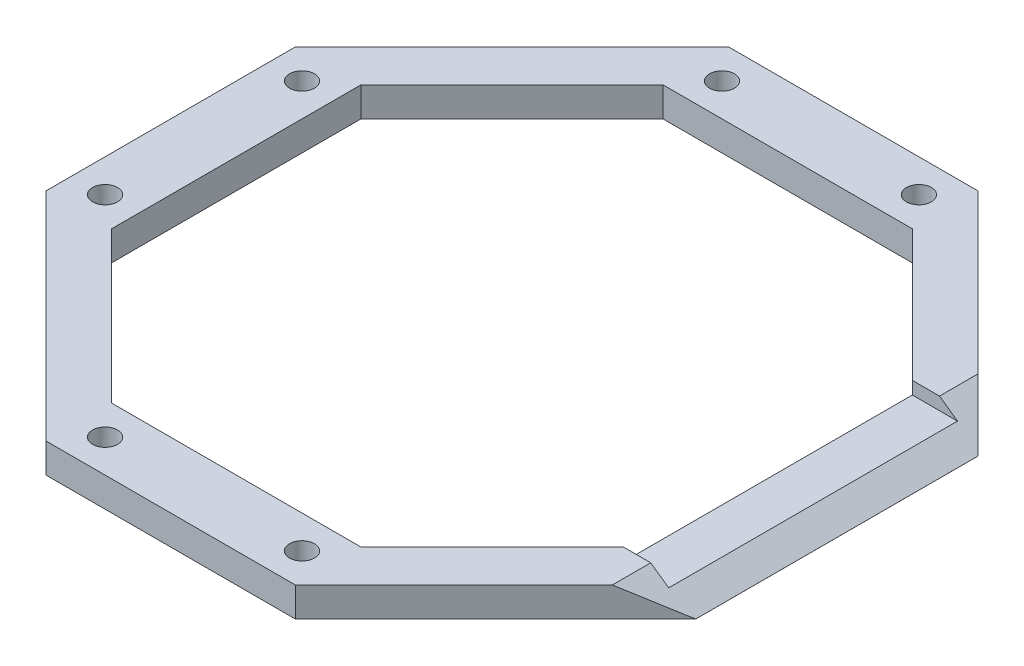
ISO-10303-21;
HEADER;
FILE_DESCRIPTION(('STEP AP214'),'2;1');
FILE_NAME('part.step','',(''),(''),'','','');
FILE_SCHEMA(('AUTOMOTIVE_DESIGN { 1 0 10303 214 1 1 1 1 }'));
ENDSEC;
DATA;
#1=APPLICATION_CONTEXT('core data for automotive mechanical design processes');
#2=APPLICATION_PROTOCOL_DEFINITION('international standard','automotive_design',2000,#1);
#3=PRODUCT_CONTEXT('',#1,'mechanical');
#4=PRODUCT('Part','Part','',(#3));
#5=PRODUCT_RELATED_PRODUCT_CATEGORY('part','',(#4));
#6=PRODUCT_DEFINITION_FORMATION('','',#4);
#7=PRODUCT_DEFINITION_CONTEXT('part definition',#1,'design');
#8=PRODUCT_DEFINITION('design','',#6,#7);
#9=PRODUCT_DEFINITION_SHAPE('','',#8);
#10=(LENGTH_UNIT() NAMED_UNIT(*) SI_UNIT(.MILLI.,.METRE.));
#11=(NAMED_UNIT(*) PLANE_ANGLE_UNIT() SI_UNIT($,.RADIAN.));
#12=(NAMED_UNIT(*) SI_UNIT($,.STERADIAN.) SOLID_ANGLE_UNIT());
#13=UNCERTAINTY_MEASURE_WITH_UNIT(LENGTH_MEASURE(1.E-05),#10,'distance_accuracy_value','');
#14=(GEOMETRIC_REPRESENTATION_CONTEXT(3) GLOBAL_UNCERTAINTY_ASSIGNED_CONTEXT((#13)) GLOBAL_UNIT_ASSIGNED_CONTEXT((#10,
#11,#12)) REPRESENTATION_CONTEXT('',''));
#15=CARTESIAN_POINT('',(0.,0.,0.));
#16=DIRECTION('',(0.,0.,1.));
#17=DIRECTION('',(1.,0.,0.));
#18=AXIS2_PLACEMENT_3D('',#15,#16,#17);
#19=CARTESIAN_POINT('',(0.,4.5,0.));
#20=DIRECTION('',(0.,1.,0.));
#21=DIRECTION('',(0.,0.,1.));
#22=AXIS2_PLACEMENT_3D('',#19,#20,#21);
#23=PLANE('',#22);
#24=CARTESIAN_POINT('',(-15.,4.5,-46.9969797719559));
#25=DIRECTION('',(0.,1.,0.));
#26=DIRECTION('',(0.,0.,1.));
#27=AXIS2_PLACEMENT_3D('',#24,#25,#26);
#28=CIRCLE('',#27,1.89999999999999);
#29=CARTESIAN_POINT('',(-15.,4.5,-45.0969797719559));
#30=VERTEX_POINT('',#29);
#31=EDGE_CURVE('E500',#30,#30,#28,.T.);
#32=ORIENTED_EDGE('',*,*,#31,.F.);
#33=EDGE_LOOP('',(#32));
#34=FACE_BOUND('',#33,.T.);
#35=CARTESIAN_POINT('',(-46.9969797719557,4.5,-15.));
#36=DIRECTION('',(0.,1.,0.));
#37=DIRECTION('',(0.,0.,1.));
#38=AXIS2_PLACEMENT_3D('',#35,#36,#37);
#39=CIRCLE('',#38,1.89999999999999);
#40=CARTESIAN_POINT('',(-46.9969797719557,4.5,-13.1));
#41=VERTEX_POINT('',#40);
#42=EDGE_CURVE('E297',#41,#41,#39,.T.);
#43=ORIENTED_EDGE('',*,*,#42,.F.);
#44=EDGE_LOOP('',(#43));
#45=FACE_BOUND('',#44,.T.);
#46=CARTESIAN_POINT('',(15.,4.5,-46.9969797719559));
#47=DIRECTION('',(0.,1.,0.));
#48=DIRECTION('',(0.,0.,1.));
#49=AXIS2_PLACEMENT_3D('',#46,#47,#48);
#50=CIRCLE('',#49,1.89999999999999);
#51=CARTESIAN_POINT('',(15.,4.5,-45.0969797719559));
#52=VERTEX_POINT('',#51);
#53=EDGE_CURVE('E287',#52,#52,#50,.T.);
#54=ORIENTED_EDGE('',*,*,#53,.F.);
#55=EDGE_LOOP('',(#54));
#56=FACE_BOUND('',#55,.T.);
#57=CARTESIAN_POINT('',(15.,4.5,46.9969797719559));
#58=DIRECTION('',(0.,1.,0.));
#59=DIRECTION('',(0.,0.,1.));
#60=AXIS2_PLACEMENT_3D('',#57,#58,#59);
#61=CIRCLE('',#60,1.89999999999999);
#62=CARTESIAN_POINT('',(15.,4.5,48.8969797719559));
#63=VERTEX_POINT('',#62);
#64=EDGE_CURVE('E284',#63,#63,#61,.T.);
#65=ORIENTED_EDGE('',*,*,#64,.F.);
#66=EDGE_LOOP('',(#65));
#67=FACE_BOUND('',#66,.T.);
#68=CARTESIAN_POINT('',(-15.,4.5,46.9969797719559));
#69=DIRECTION('',(0.,1.,0.));
#70=DIRECTION('',(0.,0.,1.));
#71=AXIS2_PLACEMENT_3D('',#68,#69,#70);
#72=CIRCLE('',#71,1.89999999999999);
#73=CARTESIAN_POINT('',(-15.,4.5,48.8969797719559));
#74=VERTEX_POINT('',#73);
#75=EDGE_CURVE('E281',#74,#74,#72,.T.);
#76=ORIENTED_EDGE('',*,*,#75,.F.);
#77=EDGE_LOOP('',(#76));
#78=FACE_BOUND('',#77,.T.);
#79=CARTESIAN_POINT('',(-46.9969797719557,4.5,15.));
#80=DIRECTION('',(0.,1.,0.));
#81=DIRECTION('',(0.,0.,1.));
#82=AXIS2_PLACEMENT_3D('',#79,#80,#81);
#83=CIRCLE('',#82,1.89999999999999);
#84=CARTESIAN_POINT('',(-46.9969797719557,4.5,16.9));
#85=VERTEX_POINT('',#84);
#86=EDGE_CURVE('E280',#85,#85,#83,.T.);
#87=ORIENTED_EDGE('',*,*,#86,.F.);
#88=EDGE_LOOP('',(#87));
#89=FACE_BOUND('',#88,.T.);
#90=DIRECTION('',(-1.,0.,0.));
#91=VECTOR('',#90,1.);
#92=CARTESIAN_POINT('',(71.4939595439114,4.5,-21.9999999999995));
#93=LINE('',#92,#91);
#94=CARTESIAN_POINT('',(43.1412186702168,4.5,-21.9999999999995));
#95=VERTEX_POINT('',#94);
#96=CARTESIAN_POINT('',(38.9939595439114,4.5,-21.9999999999995));
#97=VERTEX_POINT('',#96);
#98=EDGE_CURVE('E187',#95,#97,#93,.T.);
#99=ORIENTED_EDGE('',*,*,#98,.F.);
#100=DIRECTION('',(0.,0.,1.));
#101=VECTOR('',#100,1.);
#102=CARTESIAN_POINT('',(43.1412186702168,4.50000000000001,-44.5030202280456));
#103=LINE('',#102,#101);
#104=CARTESIAN_POINT('',(43.1412186702167,4.50000000000001,-27.8539993935419));
#105=VERTEX_POINT('',#104);
#106=EDGE_CURVE('E313',#105,#95,#103,.T.);
#107=ORIENTED_EDGE('',*,*,#106,.F.);
#108=DIRECTION('',(-0.707036743398339,0.,-0.707176812038313));
#109=VECTOR('',#108,1.);
#110=CARTESIAN_POINT('',(19.0030202280441,4.5,-51.9969797719559));
#111=LINE('',#110,#109);
#112=CARTESIAN_POINT('',(19.0030202280441,4.5,-51.9969797719559));
#113=VERTEX_POINT('',#112);
#114=EDGE_CURVE('E218',#105,#113,#111,.T.);
#115=ORIENTED_EDGE('',*,*,#114,.T.);
#116=DIRECTION('',(-1.,0.,0.));
#117=VECTOR('',#116,1.);
#118=CARTESIAN_POINT('',(19.0030202280441,4.5,-51.9969797719559));
#119=LINE('',#118,#117);
#120=CARTESIAN_POINT('',(-18.9969797719562,4.5,-51.9969797719559));
#121=VERTEX_POINT('',#120);
#122=EDGE_CURVE('E220',#113,#121,#119,.T.);
#123=ORIENTED_EDGE('',*,*,#122,.T.);
#124=DIRECTION('',(-0.707106781186547,0.,0.707106781186547));
#125=VECTOR('',#124,1.);
#126=CARTESIAN_POINT('',(-51.9969797719557,4.5,-18.9969797719563));
#127=LINE('',#126,#125);
#128=CARTESIAN_POINT('',(-51.9969797719557,4.5,-18.9969797719563));
#129=VERTEX_POINT('',#128);
#130=EDGE_CURVE('E223',#121,#129,#127,.T.);
#131=ORIENTED_EDGE('',*,*,#130,.T.);
#132=DIRECTION('',(0.,0.,1.));
#133=VECTOR('',#132,1.);
#134=CARTESIAN_POINT('',(-51.9969797719557,4.5,18.9969797719549));
#135=LINE('',#134,#133);
#136=CARTESIAN_POINT('',(-51.9969797719557,4.5,18.9969797719549));
#137=VERTEX_POINT('',#136);
#138=EDGE_CURVE('E225',#129,#137,#135,.T.);
#139=ORIENTED_EDGE('',*,*,#138,.T.);
#140=DIRECTION('',(0.707106781186551,0.,0.707106781186544));
#141=VECTOR('',#140,1.);
#142=CARTESIAN_POINT('',(-18.9969797719559,4.5,51.9969797719544));
#143=LINE('',#142,#141);
#144=CARTESIAN_POINT('',(-18.9969797719559,4.5,51.9969797719544));
#145=VERTEX_POINT('',#144);
#146=EDGE_CURVE('E227',#137,#145,#143,.T.);
#147=ORIENTED_EDGE('',*,*,#146,.T.);
#148=DIRECTION('',(1.,0.,0.));
#149=VECTOR('',#148,1.);
#150=CARTESIAN_POINT('',(19.0030202280446,4.5,51.9969797719544));
#151=LINE('',#150,#149);
#152=CARTESIAN_POINT('',(19.0030202280446,4.5,51.9969797719544));
#153=VERTEX_POINT('',#152);
#154=EDGE_CURVE('E229',#145,#153,#151,.T.);
#155=ORIENTED_EDGE('',*,*,#154,.T.);
#156=DIRECTION('',(0.70703674339835,0.,-0.707176812038302));
#157=VECTOR('',#156,1.);
#158=CARTESIAN_POINT('',(49.4939595439114,4.5,21.5));
#159=LINE('',#158,#157);
#160=CARTESIAN_POINT('',(43.1412186702168,4.50000000000001,27.8539993935417));
#161=VERTEX_POINT('',#160);
#162=EDGE_CURVE('E231',#153,#161,#159,.T.);
#163=ORIENTED_EDGE('',*,*,#162,.T.);
#164=CARTESIAN_POINT('',(43.1412186702167,4.50000000000001,22.0000000000005));
#165=VERTEX_POINT('',#164);
#166=EDGE_CURVE('E308',#165,#161,#103,.T.);
#167=ORIENTED_EDGE('',*,*,#166,.F.);
#168=DIRECTION('',(-1.,0.,0.));
#169=VECTOR('',#168,1.);
#170=CARTESIAN_POINT('',(71.4939595439114,4.5,22.0000000000005));
#171=LINE('',#170,#169);
#172=CARTESIAN_POINT('',(38.9939595439114,4.5,22.0000000000005));
#173=VERTEX_POINT('',#172);
#174=EDGE_CURVE('E309',#165,#173,#171,.T.);
#175=ORIENTED_EDGE('',*,*,#174,.T.);
#176=DIRECTION('',(0.707106781186569,0.,-0.707106781186526));
#177=VECTOR('',#176,1.);
#178=CARTESIAN_POINT('',(18.9969797719549,4.5,41.9969797719557));
#179=LINE('',#178,#177);
#180=CARTESIAN_POINT('',(18.9969797719549,4.5,41.9969797719557));
#181=VERTEX_POINT('',#180);
#182=EDGE_CURVE('E325',#181,#173,#179,.T.);
#183=ORIENTED_EDGE('',*,*,#182,.F.);
#184=DIRECTION('',(1.,0.,0.));
#185=VECTOR('',#184,1.);
#186=CARTESIAN_POINT('',(18.9969797719549,4.5,41.9969797719557));
#187=LINE('',#186,#185);
#188=CARTESIAN_POINT('',(-18.9969797719563,4.5,41.9969797719557));
#189=VERTEX_POINT('',#188);
#190=EDGE_CURVE('E322',#189,#181,#187,.T.);
#191=ORIENTED_EDGE('',*,*,#190,.F.);
#192=DIRECTION('',(0.707106781186526,0.,0.707106781186569));
#193=VECTOR('',#192,1.);
#194=CARTESIAN_POINT('',(-18.9969797719563,4.5,41.9969797719557));
#195=LINE('',#194,#193);
#196=CARTESIAN_POINT('',(-41.9969797719557,4.5,18.9969797719549));
#197=VERTEX_POINT('',#196);
#198=EDGE_CURVE('E320',#197,#189,#195,.T.);
#199=ORIENTED_EDGE('',*,*,#198,.F.);
#200=DIRECTION('',(0.,0.,1.));
#201=VECTOR('',#200,1.);
#202=CARTESIAN_POINT('',(-41.9969797719557,4.5,18.9969797719549));
#203=LINE('',#202,#201);
#204=CARTESIAN_POINT('',(-41.9969797719557,4.5,-18.9969797719563));
#205=VERTEX_POINT('',#204);
#206=EDGE_CURVE('E335',#205,#197,#203,.T.);
#207=ORIENTED_EDGE('',*,*,#206,.F.);
#208=DIRECTION('',(-0.707106781186569,0.,0.707106781186526));
#209=VECTOR('',#208,1.);
#210=CARTESIAN_POINT('',(-41.9969797719557,4.5,-18.9969797719563));
#211=LINE('',#210,#209);
#212=CARTESIAN_POINT('',(-18.9969797719549,4.5,-41.9969797719557));
#213=VERTEX_POINT('',#212);
#214=EDGE_CURVE('E332',#213,#205,#211,.T.);
#215=ORIENTED_EDGE('',*,*,#214,.F.);
#216=DIRECTION('',(-1.,0.,0.));
#217=VECTOR('',#216,1.);
#218=CARTESIAN_POINT('',(-18.9969797719549,4.5,-41.9969797719557));
#219=LINE('',#218,#217);
#220=CARTESIAN_POINT('',(18.9969797719563,4.5,-41.9969797719557));
#221=VERTEX_POINT('',#220);
#222=EDGE_CURVE('E330',#221,#213,#219,.T.);
#223=ORIENTED_EDGE('',*,*,#222,.F.);
#224=DIRECTION('',(-0.707106781186526,0.,-0.707106781186569));
#225=VECTOR('',#224,1.);
#226=CARTESIAN_POINT('',(18.9969797719563,4.5,-41.9969797719557));
#227=LINE('',#226,#225);
#228=EDGE_CURVE('E328',#97,#221,#227,.T.);
#229=ORIENTED_EDGE('',*,*,#228,.F.);
#230=EDGE_LOOP('',(#99,#107,#115,#123,#131,#139,#147,#155,#163,#167,#175,#183,#191,#199,#207,
#215,#223,#229));
#231=FACE_BOUND('',#230,.T.);
#232=ADVANCED_FACE('F36',(#34,#45,#56,#67,#78,#89,#231),#23,.T.);
#233=CARTESIAN_POINT('',(19.0030202280441,4.5,-51.9969797719559));
#234=DIRECTION('',(-0.707176812038313,0.,0.707036743398339));
#235=DIRECTION('',(0.707036743398339,0.,0.707176812038313));
#236=AXIS2_PLACEMENT_3D('',#233,#234,#235);
#237=PLANE('',#236);
#238=DIRECTION('',(-0.632302386877257,0.447469506086105,-0.632427650148522));
#239=VECTOR('',#238,1.);
#240=CARTESIAN_POINT('',(23.8361865712853,18.161838635384,-47.1628559465996));
#241=LINE('',#240,#239);
#242=CARTESIAN_POINT('',(49.4939595439114,0.0042747267108463,-21.5));
#243=VERTEX_POINT('',#242);
#244=EDGE_CURVE('E317',#243,#105,#241,.T.);
#245=ORIENTED_EDGE('',*,*,#244,.F.);
#246=DIRECTION('',(0.,-1.,0.));
#247=VECTOR('',#246,1.);
#248=CARTESIAN_POINT('',(49.4939595439114,4.5,-21.5));
#249=LINE('',#248,#247);
#250=CARTESIAN_POINT('',(49.4939595439114,0.,-21.5));
#251=VERTEX_POINT('',#250);
#252=EDGE_CURVE('E234',#243,#251,#249,.T.);
#253=ORIENTED_EDGE('',*,*,#252,.T.);
#254=DIRECTION('',(-0.707036743398339,0.,-0.707176812038313));
#255=VECTOR('',#254,1.);
#256=CARTESIAN_POINT('',(19.0030202280441,0.,-51.9969797719559));
#257=LINE('',#256,#255);
#258=CARTESIAN_POINT('',(19.0030202280441,0.,-51.9969797719559));
#259=VERTEX_POINT('',#258);
#260=EDGE_CURVE('E217',#251,#259,#257,.T.);
#261=ORIENTED_EDGE('',*,*,#260,.T.);
#262=DIRECTION('',(0.,-1.,0.));
#263=VECTOR('',#262,1.);
#264=CARTESIAN_POINT('',(19.0030202280441,4.5,-51.9969797719559));
#265=LINE('',#264,#263);
#266=EDGE_CURVE('E270',#113,#259,#265,.T.);
#267=ORIENTED_EDGE('',*,*,#266,.F.);
#268=ORIENTED_EDGE('',*,*,#114,.F.);
#269=EDGE_LOOP('',(#245,#253,#261,#267,#268));
#270=FACE_BOUND('',#269,.T.);
#271=ADVANCED_FACE('F38',(#270),#237,.F.);
#272=CARTESIAN_POINT('',(49.4939595439114,4.5,21.5));
#273=DIRECTION('',(-0.707176812038302,0.,-0.70703674339835));
#274=DIRECTION('',(-0.70703674339835,0.,0.707176812038302));
#275=AXIS2_PLACEMENT_3D('',#272,#273,#274);
#276=PLANE('',#275);
#277=DIRECTION('',(0.632302386877265,-0.44746950608611,-0.63242765014851));
#278=VECTOR('',#277,1.);
#279=CARTESIAN_POINT('',(48.2219568527565,0.904449117578314,22.7722546832736));
#280=LINE('',#279,#278);
#281=CARTESIAN_POINT('',(49.4939595439114,0.0042747267108463,21.5));
#282=VERTEX_POINT('',#281);
#283=EDGE_CURVE('E61',#161,#282,#280,.T.);
#284=ORIENTED_EDGE('',*,*,#283,.F.);
#285=ORIENTED_EDGE('',*,*,#162,.F.);
#286=DIRECTION('',(0.,-1.,0.));
#287=VECTOR('',#286,1.);
#288=CARTESIAN_POINT('',(19.0030202280446,4.5,51.9969797719544));
#289=LINE('',#288,#287);
#290=CARTESIAN_POINT('',(19.0030202280446,0.,51.9969797719544));
#291=VERTEX_POINT('',#290);
#292=EDGE_CURVE('E255',#153,#291,#289,.T.);
#293=ORIENTED_EDGE('',*,*,#292,.T.);
#294=DIRECTION('',(0.70703674339835,0.,-0.707176812038302));
#295=VECTOR('',#294,1.);
#296=CARTESIAN_POINT('',(49.4939595439114,0.,21.5));
#297=LINE('',#296,#295);
#298=CARTESIAN_POINT('',(49.4939595439114,0.,21.5));
#299=VERTEX_POINT('',#298);
#300=EDGE_CURVE('E247',#291,#299,#297,.T.);
#301=ORIENTED_EDGE('',*,*,#300,.T.);
#302=DIRECTION('',(0.,-1.,0.));
#303=VECTOR('',#302,1.);
#304=CARTESIAN_POINT('',(49.4939595439114,4.5,21.5));
#305=LINE('',#304,#303);
#306=EDGE_CURVE('E253',#282,#299,#305,.T.);
#307=ORIENTED_EDGE('',*,*,#306,.F.);
#308=EDGE_LOOP('',(#284,#285,#293,#301,#307));
#309=FACE_BOUND('',#308,.T.);
#310=ADVANCED_FACE('F388',(#309),#276,.F.);
#311=CARTESIAN_POINT('',(49.4939595439114,4.5,-21.5));
#312=DIRECTION('',(-1.,0.,0.));
#313=DIRECTION('',(0.,0.,1.));
#314=AXIS2_PLACEMENT_3D('',#311,#312,#313);
#315=PLANE('',#314);
#316=DIRECTION('',(0.,0.,-1.));
#317=VECTOR('',#316,1.);
#318=CARTESIAN_POINT('',(49.4939595439114,0.0042747267108463,-21.5));
#319=LINE('',#318,#317);
#320=EDGE_CURVE('E273',#282,#243,#319,.T.);
#321=ORIENTED_EDGE('',*,*,#320,.F.);
#322=ORIENTED_EDGE('',*,*,#306,.T.);
#323=DIRECTION('',(0.,0.,-1.));
#324=VECTOR('',#323,1.);
#325=CARTESIAN_POINT('',(49.4939595439114,0.,-21.5));
#326=LINE('',#325,#324);
#327=EDGE_CURVE('E221',#299,#251,#326,.T.);
#328=ORIENTED_EDGE('',*,*,#327,.T.);
#329=ORIENTED_EDGE('',*,*,#252,.F.);
#330=EDGE_LOOP('',(#321,#322,#328,#329));
#331=FACE_BOUND('',#330,.T.);
#332=ADVANCED_FACE('F392',(#331),#315,.F.);
#333=CARTESIAN_POINT('',(0.,0.,0.));
#334=DIRECTION('',(0.,1.,0.));
#335=DIRECTION('',(0.,0.,1.));
#336=AXIS2_PLACEMENT_3D('',#333,#334,#335);
#337=PLANE('',#336);
#338=CARTESIAN_POINT('',(-15.,0.,-46.9969797719559));
#339=DIRECTION('',(0.,1.,0.));
#340=DIRECTION('',(0.,0.,1.));
#341=AXIS2_PLACEMENT_3D('',#338,#339,#340);
#342=CIRCLE('',#341,1.89999999999999);
#343=CARTESIAN_POINT('',(-15.,0.,-45.0969797719559));
#344=VERTEX_POINT('',#343);
#345=EDGE_CURVE('E502',#344,#344,#342,.T.);
#346=ORIENTED_EDGE('',*,*,#345,.T.);
#347=EDGE_LOOP('',(#346));
#348=FACE_BOUND('',#347,.T.);
#349=CARTESIAN_POINT('',(-46.9969797719557,0.,-15.));
#350=DIRECTION('',(0.,1.,0.));
#351=DIRECTION('',(0.,0.,1.));
#352=AXIS2_PLACEMENT_3D('',#349,#350,#351);
#353=CIRCLE('',#352,1.89999999999999);
#354=CARTESIAN_POINT('',(-46.9969797719557,0.,-13.1));
#355=VERTEX_POINT('',#354);
#356=EDGE_CURVE('E40',#355,#355,#353,.T.);
#357=ORIENTED_EDGE('',*,*,#356,.T.);
#358=EDGE_LOOP('',(#357));
#359=FACE_BOUND('',#358,.T.);
#360=CARTESIAN_POINT('',(15.,0.,-46.9969797719559));
#361=DIRECTION('',(0.,1.,0.));
#362=DIRECTION('',(0.,0.,1.));
#363=AXIS2_PLACEMENT_3D('',#360,#361,#362);
#364=CIRCLE('',#363,1.89999999999999);
#365=CARTESIAN_POINT('',(15.,0.,-45.0969797719559));
#366=VERTEX_POINT('',#365);
#367=EDGE_CURVE('E285',#366,#366,#364,.T.);
#368=ORIENTED_EDGE('',*,*,#367,.T.);
#369=EDGE_LOOP('',(#368));
#370=FACE_BOUND('',#369,.T.);
#371=CARTESIAN_POINT('',(15.,0.,46.9969797719559));
#372=DIRECTION('',(0.,1.,0.));
#373=DIRECTION('',(0.,0.,1.));
#374=AXIS2_PLACEMENT_3D('',#371,#372,#373);
#375=CIRCLE('',#374,1.89999999999999);
#376=CARTESIAN_POINT('',(15.,0.,48.8969797719559));
#377=VERTEX_POINT('',#376);
#378=EDGE_CURVE('E282',#377,#377,#375,.T.);
#379=ORIENTED_EDGE('',*,*,#378,.T.);
#380=EDGE_LOOP('',(#379));
#381=FACE_BOUND('',#380,.T.);
#382=CARTESIAN_POINT('',(-15.,0.,46.9969797719559));
#383=DIRECTION('',(0.,1.,0.));
#384=DIRECTION('',(0.,0.,1.));
#385=AXIS2_PLACEMENT_3D('',#382,#383,#384);
#386=CIRCLE('',#385,1.89999999999999);
#387=CARTESIAN_POINT('',(-15.,0.,48.8969797719559));
#388=VERTEX_POINT('',#387);
#389=EDGE_CURVE('E277',#388,#388,#386,.T.);
#390=ORIENTED_EDGE('',*,*,#389,.T.);
#391=EDGE_LOOP('',(#390));
#392=FACE_BOUND('',#391,.T.);
#393=CARTESIAN_POINT('',(-46.9969797719557,0.,15.));
#394=DIRECTION('',(0.,1.,0.));
#395=DIRECTION('',(0.,0.,1.));
#396=AXIS2_PLACEMENT_3D('',#393,#394,#395);
#397=CIRCLE('',#396,1.89999999999999);
#398=CARTESIAN_POINT('',(-46.9969797719557,0.,16.9));
#399=VERTEX_POINT('',#398);
#400=EDGE_CURVE('E199',#399,#399,#397,.T.);
#401=ORIENTED_EDGE('',*,*,#400,.T.);
#402=EDGE_LOOP('',(#401));
#403=FACE_BOUND('',#402,.T.);
#404=ORIENTED_EDGE('',*,*,#260,.F.);
#405=ORIENTED_EDGE('',*,*,#327,.F.);
#406=ORIENTED_EDGE('',*,*,#300,.F.);
#407=DIRECTION('',(1.,0.,0.));
#408=VECTOR('',#407,1.);
#409=CARTESIAN_POINT('',(19.0030202280446,0.,51.9969797719544));
#410=LINE('',#409,#408);
#411=CARTESIAN_POINT('',(-18.9969797719559,0.,51.9969797719544));
#412=VERTEX_POINT('',#411);
#413=EDGE_CURVE('E245',#412,#291,#410,.T.);
#414=ORIENTED_EDGE('',*,*,#413,.F.);
#415=DIRECTION('',(0.707106781186551,0.,0.707106781186544));
#416=VECTOR('',#415,1.);
#417=CARTESIAN_POINT('',(-18.9969797719559,0.,51.9969797719544));
#418=LINE('',#417,#416);
#419=CARTESIAN_POINT('',(-51.9969797719557,0.,18.9969797719549));
#420=VERTEX_POINT('',#419);
#421=EDGE_CURVE('E243',#420,#412,#418,.T.);
#422=ORIENTED_EDGE('',*,*,#421,.F.);
#423=DIRECTION('',(0.,0.,1.));
#424=VECTOR('',#423,1.);
#425=CARTESIAN_POINT('',(-51.9969797719557,0.,18.9969797719549));
#426=LINE('',#425,#424);
#427=CARTESIAN_POINT('',(-51.9969797719557,0.,-18.9969797719563));
#428=VERTEX_POINT('',#427);
#429=EDGE_CURVE('E241',#428,#420,#426,.T.);
#430=ORIENTED_EDGE('',*,*,#429,.F.);
#431=DIRECTION('',(-0.707106781186547,0.,0.707106781186547));
#432=VECTOR('',#431,1.);
#433=CARTESIAN_POINT('',(-51.9969797719557,0.,-18.9969797719563));
#434=LINE('',#433,#432);
#435=CARTESIAN_POINT('',(-18.9969797719562,0.,-51.9969797719559));
#436=VERTEX_POINT('',#435);
#437=EDGE_CURVE('E239',#436,#428,#434,.T.);
#438=ORIENTED_EDGE('',*,*,#437,.F.);
#439=DIRECTION('',(-1.,0.,0.));
#440=VECTOR('',#439,1.);
#441=CARTESIAN_POINT('',(19.0030202280441,0.,-51.9969797719559));
#442=LINE('',#441,#440);
#443=EDGE_CURVE('E237',#259,#436,#442,.T.);
#444=ORIENTED_EDGE('',*,*,#443,.F.);
#445=EDGE_LOOP('',(#404,#405,#406,#414,#422,#430,#438,#444));
#446=FACE_BOUND('',#445,.T.);
#447=DIRECTION('',(0.707106781186526,0.,0.707106781186569));
#448=VECTOR('',#447,1.);
#449=CARTESIAN_POINT('',(-18.9969797719563,0.,41.9969797719557));
#450=LINE('',#449,#448);
#451=CARTESIAN_POINT('',(-41.9969797719557,0.,18.9969797719549));
#452=VERTEX_POINT('',#451);
#453=CARTESIAN_POINT('',(-18.9969797719563,0.,41.9969797719557));
#454=VERTEX_POINT('',#453);
#455=EDGE_CURVE('E319',#452,#454,#450,.T.);
#456=ORIENTED_EDGE('',*,*,#455,.T.);
#457=DIRECTION('',(1.,0.,0.));
#458=VECTOR('',#457,1.);
#459=CARTESIAN_POINT('',(18.9969797719549,0.,41.9969797719557));
#460=LINE('',#459,#458);
#461=CARTESIAN_POINT('',(18.9969797719549,0.,41.9969797719557));
#462=VERTEX_POINT('',#461);
#463=EDGE_CURVE('E340',#454,#462,#460,.T.);
#464=ORIENTED_EDGE('',*,*,#463,.T.);
#465=DIRECTION('',(0.707106781186569,0.,-0.707106781186526));
#466=VECTOR('',#465,1.);
#467=CARTESIAN_POINT('',(18.9969797719549,0.,41.9969797719557));
#468=LINE('',#467,#466);
#469=CARTESIAN_POINT('',(38.9939595439114,0.,22.0000000000005));
#470=VERTEX_POINT('',#469);
#471=EDGE_CURVE('E343',#462,#470,#468,.T.);
#472=ORIENTED_EDGE('',*,*,#471,.T.);
#473=DIRECTION('',(0.,0.,-1.));
#474=VECTOR('',#473,1.);
#475=CARTESIAN_POINT('',(38.9939595439114,0.,-21.9999999999995));
#476=LINE('',#475,#474);
#477=CARTESIAN_POINT('',(38.9939595439114,0.,-21.9999999999995));
#478=VERTEX_POINT('',#477);
#479=EDGE_CURVE('E346',#470,#478,#476,.T.);
#480=ORIENTED_EDGE('',*,*,#479,.T.);
#481=DIRECTION('',(-0.707106781186526,0.,-0.707106781186569));
#482=VECTOR('',#481,1.);
#483=CARTESIAN_POINT('',(18.9969797719563,0.,-41.9969797719557));
#484=LINE('',#483,#482);
#485=CARTESIAN_POINT('',(18.9969797719563,0.,-41.9969797719557));
#486=VERTEX_POINT('',#485);
#487=EDGE_CURVE('E203',#478,#486,#484,.T.);
#488=ORIENTED_EDGE('',*,*,#487,.T.);
#489=DIRECTION('',(-1.,0.,0.));
#490=VECTOR('',#489,1.);
#491=CARTESIAN_POINT('',(-18.9969797719549,0.,-41.9969797719557));
#492=LINE('',#491,#490);
#493=CARTESIAN_POINT('',(-18.9969797719549,0.,-41.9969797719557));
#494=VERTEX_POINT('',#493);
#495=EDGE_CURVE('E349',#486,#494,#492,.T.);
#496=ORIENTED_EDGE('',*,*,#495,.T.);
#497=DIRECTION('',(-0.707106781186569,0.,0.707106781186526));
#498=VECTOR('',#497,1.);
#499=CARTESIAN_POINT('',(-41.9969797719557,0.,-18.9969797719563));
#500=LINE('',#499,#498);
#501=CARTESIAN_POINT('',(-41.9969797719557,0.,-18.9969797719563));
#502=VERTEX_POINT('',#501);
#503=EDGE_CURVE('E352',#494,#502,#500,.T.);
#504=ORIENTED_EDGE('',*,*,#503,.T.);
#505=DIRECTION('',(0.,0.,1.));
#506=VECTOR('',#505,1.);
#507=CARTESIAN_POINT('',(-41.9969797719557,0.,18.9969797719549));
#508=LINE('',#507,#506);
#509=EDGE_CURVE('E323',#502,#452,#508,.T.);
#510=ORIENTED_EDGE('',*,*,#509,.T.);
#511=EDGE_LOOP('',(#456,#464,#472,#480,#488,#496,#504,#510));
#512=FACE_BOUND('',#511,.T.);
#513=ADVANCED_FACE('F372',(#348,#359,#370,#381,#392,#403,#446,#512),#337,.F.);
#514=CARTESIAN_POINT('',(19.0030202280441,4.5,-51.9969797719559));
#515=DIRECTION('',(0.,0.,1.));
#516=DIRECTION('',(1.,0.,0.));
#517=AXIS2_PLACEMENT_3D('',#514,#515,#516);
#518=PLANE('',#517);
#519=ORIENTED_EDGE('',*,*,#443,.T.);
#520=DIRECTION('',(0.,-1.,0.));
#521=VECTOR('',#520,1.);
#522=CARTESIAN_POINT('',(-18.9969797719562,4.5,-51.9969797719559));
#523=LINE('',#522,#521);
#524=EDGE_CURVE('E267',#121,#436,#523,.T.);
#525=ORIENTED_EDGE('',*,*,#524,.F.);
#526=ORIENTED_EDGE('',*,*,#122,.F.);
#527=ORIENTED_EDGE('',*,*,#266,.T.);
#528=EDGE_LOOP('',(#519,#525,#526,#527));
#529=FACE_BOUND('',#528,.T.);
#530=ADVANCED_FACE('F403',(#529),#518,.F.);
#531=CARTESIAN_POINT('',(-51.9969797719557,4.5,-18.9969797719563));
#532=DIRECTION('',(0.707106781186547,0.,0.707106781186547));
#533=DIRECTION('',(0.707106781186548,0.,-0.707106781186548));
#534=AXIS2_PLACEMENT_3D('',#531,#532,#533);
#535=PLANE('',#534);
#536=ORIENTED_EDGE('',*,*,#437,.T.);
#537=DIRECTION('',(0.,-1.,0.));
#538=VECTOR('',#537,1.);
#539=CARTESIAN_POINT('',(-51.9969797719557,4.5,-18.9969797719563));
#540=LINE('',#539,#538);
#541=EDGE_CURVE('E264',#129,#428,#540,.T.);
#542=ORIENTED_EDGE('',*,*,#541,.F.);
#543=ORIENTED_EDGE('',*,*,#130,.F.);
#544=ORIENTED_EDGE('',*,*,#524,.T.);
#545=EDGE_LOOP('',(#536,#542,#543,#544));
#546=FACE_BOUND('',#545,.T.);
#547=ADVANCED_FACE('F408',(#546),#535,.F.);
#548=CARTESIAN_POINT('',(-51.9969797719557,4.5,18.9969797719549));
#549=DIRECTION('',(1.,0.,0.));
#550=DIRECTION('',(0.,0.,-1.));
#551=AXIS2_PLACEMENT_3D('',#548,#549,#550);
#552=PLANE('',#551);
#553=ORIENTED_EDGE('',*,*,#429,.T.);
#554=DIRECTION('',(0.,-1.,0.));
#555=VECTOR('',#554,1.);
#556=CARTESIAN_POINT('',(-51.9969797719557,4.5,18.9969797719549));
#557=LINE('',#556,#555);
#558=EDGE_CURVE('E261',#137,#420,#557,.T.);
#559=ORIENTED_EDGE('',*,*,#558,.F.);
#560=ORIENTED_EDGE('',*,*,#138,.F.);
#561=ORIENTED_EDGE('',*,*,#541,.T.);
#562=EDGE_LOOP('',(#553,#559,#560,#561));
#563=FACE_BOUND('',#562,.T.);
#564=ADVANCED_FACE('F414',(#563),#552,.F.);
#565=CARTESIAN_POINT('',(-18.9969797719559,4.5,51.9969797719544));
#566=DIRECTION('',(0.707106781186544,0.,-0.707106781186551));
#567=DIRECTION('',(-0.707106781186551,0.,-0.707106781186544));
#568=AXIS2_PLACEMENT_3D('',#565,#566,#567);
#569=PLANE('',#568);
#570=ORIENTED_EDGE('',*,*,#421,.T.);
#571=DIRECTION('',(0.,-1.,0.));
#572=VECTOR('',#571,1.);
#573=CARTESIAN_POINT('',(-18.9969797719559,4.5,51.9969797719544));
#574=LINE('',#573,#572);
#575=EDGE_CURVE('E258',#145,#412,#574,.T.);
#576=ORIENTED_EDGE('',*,*,#575,.F.);
#577=ORIENTED_EDGE('',*,*,#146,.F.);
#578=ORIENTED_EDGE('',*,*,#558,.T.);
#579=EDGE_LOOP('',(#570,#576,#577,#578));
#580=FACE_BOUND('',#579,.T.);
#581=ADVANCED_FACE('F418',(#580),#569,.F.);
#582=CARTESIAN_POINT('',(19.0030202280446,4.5,51.9969797719544));
#583=DIRECTION('',(0.,0.,-1.));
#584=DIRECTION('',(-1.,0.,0.));
#585=AXIS2_PLACEMENT_3D('',#582,#583,#584);
#586=PLANE('',#585);
#587=ORIENTED_EDGE('',*,*,#413,.T.);
#588=ORIENTED_EDGE('',*,*,#292,.F.);
#589=ORIENTED_EDGE('',*,*,#154,.F.);
#590=ORIENTED_EDGE('',*,*,#575,.T.);
#591=EDGE_LOOP('',(#587,#588,#589,#590));
#592=FACE_BOUND('',#591,.T.);
#593=ADVANCED_FACE('F423',(#592),#586,.F.);
#594=CARTESIAN_POINT('',(-18.9969797719563,4.5,41.9969797719557));
#595=DIRECTION('',(0.707106781186569,0.,-0.707106781186526));
#596=DIRECTION('',(-0.707106781186526,0.,-0.707106781186569));
#597=AXIS2_PLACEMENT_3D('',#594,#595,#596);
#598=PLANE('',#597);
#599=ORIENTED_EDGE('',*,*,#455,.F.);
#600=DIRECTION('',(0.,-1.,0.));
#601=VECTOR('',#600,1.);
#602=CARTESIAN_POINT('',(-41.9969797719557,4.5,18.9969797719549));
#603=LINE('',#602,#601);
#604=EDGE_CURVE('E337',#197,#452,#603,.T.);
#605=ORIENTED_EDGE('',*,*,#604,.F.);
#606=ORIENTED_EDGE('',*,*,#198,.T.);
#607=DIRECTION('',(0.,-1.,0.));
#608=VECTOR('',#607,1.);
#609=CARTESIAN_POINT('',(-18.9969797719563,4.5,41.9969797719557));
#610=LINE('',#609,#608);
#611=EDGE_CURVE('E214',#189,#454,#610,.T.);
#612=ORIENTED_EDGE('',*,*,#611,.T.);
#613=EDGE_LOOP('',(#599,#605,#606,#612));
#614=FACE_BOUND('',#613,.T.);
#615=ADVANCED_FACE('F444',(#614),#598,.T.);
#616=CARTESIAN_POINT('',(18.9969797719549,4.5,41.9969797719557));
#617=DIRECTION('',(0.,0.,-1.));
#618=DIRECTION('',(-1.,0.,0.));
#619=AXIS2_PLACEMENT_3D('',#616,#617,#618);
#620=PLANE('',#619);
#621=ORIENTED_EDGE('',*,*,#463,.F.);
#622=ORIENTED_EDGE('',*,*,#611,.F.);
#623=ORIENTED_EDGE('',*,*,#190,.T.);
#624=DIRECTION('',(0.,-1.,0.));
#625=VECTOR('',#624,1.);
#626=CARTESIAN_POINT('',(18.9969797719549,4.5,41.9969797719557));
#627=LINE('',#626,#625);
#628=EDGE_CURVE('E212',#181,#462,#627,.T.);
#629=ORIENTED_EDGE('',*,*,#628,.T.);
#630=EDGE_LOOP('',(#621,#622,#623,#629));
#631=FACE_BOUND('',#630,.T.);
#632=ADVANCED_FACE('F447',(#631),#620,.T.);
#633=CARTESIAN_POINT('',(18.9969797719549,4.5,41.9969797719557));
#634=DIRECTION('',(-0.707106781186526,0.,-0.707106781186569));
#635=DIRECTION('',(-0.707106781186569,0.,0.707106781186526));
#636=AXIS2_PLACEMENT_3D('',#633,#634,#635);
#637=PLANE('',#636);
#638=ORIENTED_EDGE('',*,*,#471,.F.);
#639=ORIENTED_EDGE('',*,*,#628,.F.);
#640=ORIENTED_EDGE('',*,*,#182,.T.);
#641=DIRECTION('',(0.,-1.,0.));
#642=VECTOR('',#641,1.);
#643=CARTESIAN_POINT('',(38.9939595439114,4.5,22.0000000000005));
#644=LINE('',#643,#642);
#645=CARTESIAN_POINT('',(38.9939595439114,2.56319429612576,22.0000000000005));
#646=VERTEX_POINT('',#645);
#647=EDGE_CURVE('E210',#173,#646,#644,.T.);
#648=ORIENTED_EDGE('',*,*,#647,.T.);
#649=EDGE_CURVE('E191',#646,#470,#644,.T.);
#650=ORIENTED_EDGE('',*,*,#649,.T.);
#651=EDGE_LOOP('',(#638,#639,#640,#648,#650));
#652=FACE_BOUND('',#651,.T.);
#653=ADVANCED_FACE('F376',(#652),#637,.T.);
#654=CARTESIAN_POINT('',(38.9939595439114,4.5,-21.9999999999995));
#655=DIRECTION('',(-1.,0.,0.));
#656=DIRECTION('',(0.,0.,1.));
#657=AXIS2_PLACEMENT_3D('',#654,#655,#656);
#658=PLANE('',#657);
#659=DIRECTION('',(0.,0.,1.));
#660=VECTOR('',#659,1.);
#661=CARTESIAN_POINT('',(38.9939595439114,2.56319429612576,0.));
#662=LINE('',#661,#660);
#663=CARTESIAN_POINT('',(38.9939595439114,2.56319429612576,-21.9999999999995));
#664=VERTEX_POINT('',#663);
#665=EDGE_CURVE('E176',#664,#646,#662,.T.);
#666=ORIENTED_EDGE('',*,*,#665,.F.);
#667=DIRECTION('',(0.,-1.,0.));
#668=VECTOR('',#667,1.);
#669=CARTESIAN_POINT('',(38.9939595439114,4.5,-21.9999999999995));
#670=LINE('',#669,#668);
#671=EDGE_CURVE('E192',#664,#478,#670,.T.);
#672=ORIENTED_EDGE('',*,*,#671,.T.);
#673=ORIENTED_EDGE('',*,*,#479,.F.);
#674=ORIENTED_EDGE('',*,*,#649,.F.);
#675=EDGE_LOOP('',(#666,#672,#673,#674));
#676=FACE_BOUND('',#675,.T.);
#677=ADVANCED_FACE('F195',(#676),#658,.T.);
#678=CARTESIAN_POINT('',(18.9969797719563,4.5,-41.9969797719557));
#679=DIRECTION('',(-0.707106781186569,0.,0.707106781186526));
#680=DIRECTION('',(0.707106781186526,0.,0.707106781186569));
#681=AXIS2_PLACEMENT_3D('',#678,#679,#680);
#682=PLANE('',#681);
#683=ORIENTED_EDGE('',*,*,#487,.F.);
#684=ORIENTED_EDGE('',*,*,#671,.F.);
#685=EDGE_CURVE('E184',#97,#664,#670,.T.);
#686=ORIENTED_EDGE('',*,*,#685,.F.);
#687=ORIENTED_EDGE('',*,*,#228,.T.);
#688=DIRECTION('',(0.,-1.,0.));
#689=VECTOR('',#688,1.);
#690=CARTESIAN_POINT('',(18.9969797719563,4.5,-41.9969797719557));
#691=LINE('',#690,#689);
#692=EDGE_CURVE('E205',#221,#486,#691,.T.);
#693=ORIENTED_EDGE('',*,*,#692,.T.);
#694=EDGE_LOOP('',(#683,#684,#686,#687,#693));
#695=FACE_BOUND('',#694,.T.);
#696=ADVANCED_FACE('F201',(#695),#682,.T.);
#697=CARTESIAN_POINT('',(-18.9969797719549,4.5,-41.9969797719557));
#698=DIRECTION('',(0.,0.,1.));
#699=DIRECTION('',(1.,0.,0.));
#700=AXIS2_PLACEMENT_3D('',#697,#698,#699);
#701=PLANE('',#700);
#702=ORIENTED_EDGE('',*,*,#495,.F.);
#703=ORIENTED_EDGE('',*,*,#692,.F.);
#704=ORIENTED_EDGE('',*,*,#222,.T.);
#705=DIRECTION('',(0.,-1.,0.));
#706=VECTOR('',#705,1.);
#707=CARTESIAN_POINT('',(-18.9969797719549,4.5,-41.9969797719557));
#708=LINE('',#707,#706);
#709=EDGE_CURVE('E206',#213,#494,#708,.T.);
#710=ORIENTED_EDGE('',*,*,#709,.T.);
#711=EDGE_LOOP('',(#702,#703,#704,#710));
#712=FACE_BOUND('',#711,.T.);
#713=ADVANCED_FACE('F364',(#712),#701,.T.);
#714=CARTESIAN_POINT('',(-41.9969797719557,4.5,-18.9969797719563));
#715=DIRECTION('',(0.707106781186526,0.,0.707106781186569));
#716=DIRECTION('',(0.707106781186569,0.,-0.707106781186526));
#717=AXIS2_PLACEMENT_3D('',#714,#715,#716);
#718=PLANE('',#717);
#719=ORIENTED_EDGE('',*,*,#503,.F.);
#720=ORIENTED_EDGE('',*,*,#709,.F.);
#721=ORIENTED_EDGE('',*,*,#214,.T.);
#722=DIRECTION('',(0.,-1.,0.));
#723=VECTOR('',#722,1.);
#724=CARTESIAN_POINT('',(-41.9969797719557,4.5,-18.9969797719563));
#725=LINE('',#724,#723);
#726=EDGE_CURVE('E359',#205,#502,#725,.T.);
#727=ORIENTED_EDGE('',*,*,#726,.T.);
#728=EDGE_LOOP('',(#719,#720,#721,#727));
#729=FACE_BOUND('',#728,.T.);
#730=ADVANCED_FACE('F369',(#729),#718,.T.);
#731=CARTESIAN_POINT('',(-41.9969797719557,4.5,18.9969797719549));
#732=DIRECTION('',(1.,0.,0.));
#733=DIRECTION('',(0.,0.,-1.));
#734=AXIS2_PLACEMENT_3D('',#731,#732,#733);
#735=PLANE('',#734);
#736=ORIENTED_EDGE('',*,*,#509,.F.);
#737=ORIENTED_EDGE('',*,*,#726,.F.);
#738=ORIENTED_EDGE('',*,*,#206,.T.);
#739=ORIENTED_EDGE('',*,*,#604,.T.);
#740=EDGE_LOOP('',(#736,#737,#738,#739));
#741=FACE_BOUND('',#740,.T.);
#742=ADVANCED_FACE('F462',(#741),#735,.T.);
#743=CARTESIAN_POINT('',(16.5179182026264,23.340851083055,-44.5030202280456));
#744=DIRECTION('',(0.577663671373556,0.816274881872047,0.));
#745=DIRECTION('',(-0.816274881872047,0.577663671373556,0.));
#746=AXIS2_PLACEMENT_3D('',#743,#744,#745);
#747=PLANE('',#746);
#748=DIRECTION('',(-0.816274881872047,0.577663671373556,0.));
#749=VECTOR('',#748,1.);
#750=CARTESIAN_POINT('',(16.5179182026264,23.340851083055,-21.9999999999995));
#751=LINE('',#750,#749);
#752=CARTESIAN_POINT('',(45.8780462144864,2.56319429612576,-21.9999999999995));
#753=VERTEX_POINT('',#752);
#754=EDGE_CURVE('E11',#753,#95,#751,.T.);
#755=ORIENTED_EDGE('',*,*,#754,.F.);
#756=DIRECTION('',(0.,0.,-1.));
#757=VECTOR('',#756,1.);
#758=CARTESIAN_POINT('',(45.8780462144864,2.56319429612576,-44.5030202280456));
#759=LINE('',#758,#757);
#760=CARTESIAN_POINT('',(45.8780462144864,2.56319429612576,22.0000000000005));
#761=VERTEX_POINT('',#760);
#762=EDGE_CURVE('E179',#761,#753,#759,.T.);
#763=ORIENTED_EDGE('',*,*,#762,.F.);
#764=DIRECTION('',(0.816274881872047,-0.577663671373556,0.));
#765=VECTOR('',#764,1.);
#766=CARTESIAN_POINT('',(16.5179182026264,23.340851083055,22.0000000000005));
#767=LINE('',#766,#765);
#768=EDGE_CURVE('E45',#165,#761,#767,.T.);
#769=ORIENTED_EDGE('',*,*,#768,.F.);
#770=ORIENTED_EDGE('',*,*,#166,.T.);
#771=ORIENTED_EDGE('',*,*,#283,.T.);
#772=ORIENTED_EDGE('',*,*,#320,.T.);
#773=ORIENTED_EDGE('',*,*,#244,.T.);
#774=ORIENTED_EDGE('',*,*,#106,.T.);
#775=EDGE_LOOP('',(#755,#763,#769,#770,#771,#772,#773,#774));
#776=FACE_BOUND('',#775,.T.);
#777=ADVANCED_FACE('F385',(#776),#747,.T.);
#778=CARTESIAN_POINT('',(71.4939595439114,0.,-21.9999999999995));
#779=DIRECTION('',(0.,0.,-1.));
#780=DIRECTION('',(-1.,0.,0.));
#781=AXIS2_PLACEMENT_3D('',#778,#779,#780);
#782=PLANE('',#781);
#783=ORIENTED_EDGE('',*,*,#754,.T.);
#784=ORIENTED_EDGE('',*,*,#98,.T.);
#785=ORIENTED_EDGE('',*,*,#685,.T.);
#786=DIRECTION('',(-1.,0.,0.));
#787=VECTOR('',#786,1.);
#788=CARTESIAN_POINT('',(71.4939595439114,2.56319429612576,-21.9999999999995));
#789=LINE('',#788,#787);
#790=EDGE_CURVE('E172',#753,#664,#789,.T.);
#791=ORIENTED_EDGE('',*,*,#790,.F.);
#792=EDGE_LOOP('',(#783,#784,#785,#791));
#793=FACE_BOUND('',#792,.T.);
#794=ADVANCED_FACE('F185',(#793),#782,.F.);
#795=CARTESIAN_POINT('',(71.4939595439114,0.,22.0000000000005));
#796=DIRECTION('',(0.,0.,1.));
#797=DIRECTION('',(1.,0.,0.));
#798=AXIS2_PLACEMENT_3D('',#795,#796,#797);
#799=PLANE('',#798);
#800=ORIENTED_EDGE('',*,*,#768,.T.);
#801=DIRECTION('',(-1.,0.,0.));
#802=VECTOR('',#801,1.);
#803=CARTESIAN_POINT('',(71.4939595439114,2.56319429612576,22.0000000000005));
#804=LINE('',#803,#802);
#805=EDGE_CURVE('E53',#761,#646,#804,.T.);
#806=ORIENTED_EDGE('',*,*,#805,.T.);
#807=ORIENTED_EDGE('',*,*,#647,.F.);
#808=ORIENTED_EDGE('',*,*,#174,.F.);
#809=EDGE_LOOP('',(#800,#806,#807,#808));
#810=FACE_BOUND('',#809,.T.);
#811=ADVANCED_FACE('F379',(#810),#799,.F.);
#812=CARTESIAN_POINT('',(71.4939595439114,2.56319429612576,0.));
#813=DIRECTION('',(0.,-1.,0.));
#814=DIRECTION('',(0.,0.,-1.));
#815=AXIS2_PLACEMENT_3D('',#812,#813,#814);
#816=PLANE('',#815);
#817=ORIENTED_EDGE('',*,*,#762,.T.);
#818=ORIENTED_EDGE('',*,*,#790,.T.);
#819=ORIENTED_EDGE('',*,*,#665,.T.);
#820=ORIENTED_EDGE('',*,*,#805,.F.);
#821=EDGE_LOOP('',(#817,#818,#819,#820));
#822=FACE_BOUND('',#821,.T.);
#823=ADVANCED_FACE('F174',(#822),#816,.F.);
#824=CARTESIAN_POINT('',(-46.9969797719557,4.5,15.));
#825=DIRECTION('',(0.,1.,0.));
#826=DIRECTION('',(0.,0.,1.));
#827=AXIS2_PLACEMENT_3D('',#824,#825,#826);
#828=CYLINDRICAL_SURFACE('',#827,1.89999999999999);
#829=ORIENTED_EDGE('',*,*,#86,.T.);
#830=EDGE_LOOP('',(#829));
#831=FACE_BOUND('',#830,.T.);
#832=ORIENTED_EDGE('',*,*,#400,.F.);
#833=EDGE_LOOP('',(#832));
#834=FACE_BOUND('',#833,.T.);
#835=ADVANCED_FACE('F472',(#831,#834),#828,.F.);
#836=CARTESIAN_POINT('',(-15.,4.5,46.9969797719559));
#837=DIRECTION('',(0.,1.,0.));
#838=DIRECTION('',(0.,0.,1.));
#839=AXIS2_PLACEMENT_3D('',#836,#837,#838);
#840=CYLINDRICAL_SURFACE('',#839,1.89999999999999);
#841=ORIENTED_EDGE('',*,*,#75,.T.);
#842=EDGE_LOOP('',(#841));
#843=FACE_BOUND('',#842,.T.);
#844=ORIENTED_EDGE('',*,*,#389,.F.);
#845=EDGE_LOOP('',(#844));
#846=FACE_BOUND('',#845,.T.);
#847=ADVANCED_FACE('F477',(#843,#846),#840,.F.);
#848=CARTESIAN_POINT('',(15.,4.5,46.9969797719559));
#849=DIRECTION('',(0.,1.,0.));
#850=DIRECTION('',(0.,0.,1.));
#851=AXIS2_PLACEMENT_3D('',#848,#849,#850);
#852=CYLINDRICAL_SURFACE('',#851,1.89999999999999);
#853=ORIENTED_EDGE('',*,*,#64,.T.);
#854=EDGE_LOOP('',(#853));
#855=FACE_BOUND('',#854,.T.);
#856=ORIENTED_EDGE('',*,*,#378,.F.);
#857=EDGE_LOOP('',(#856));
#858=FACE_BOUND('',#857,.T.);
#859=ADVANCED_FACE('F481',(#855,#858),#852,.F.);
#860=CARTESIAN_POINT('',(15.,4.5,-46.9969797719559));
#861=DIRECTION('',(0.,1.,0.));
#862=DIRECTION('',(0.,0.,1.));
#863=AXIS2_PLACEMENT_3D('',#860,#861,#862);
#864=CYLINDRICAL_SURFACE('',#863,1.89999999999999);
#865=ORIENTED_EDGE('',*,*,#53,.T.);
#866=EDGE_LOOP('',(#865));
#867=FACE_BOUND('',#866,.T.);
#868=ORIENTED_EDGE('',*,*,#367,.F.);
#869=EDGE_LOOP('',(#868));
#870=FACE_BOUND('',#869,.T.);
#871=ADVANCED_FACE('F485',(#867,#870),#864,.F.);
#872=CARTESIAN_POINT('',(-46.9969797719557,4.5,-15.));
#873=DIRECTION('',(0.,1.,0.));
#874=DIRECTION('',(0.,0.,1.));
#875=AXIS2_PLACEMENT_3D('',#872,#873,#874);
#876=CYLINDRICAL_SURFACE('',#875,1.89999999999999);
#877=ORIENTED_EDGE('',*,*,#42,.T.);
#878=EDGE_LOOP('',(#877));
#879=FACE_BOUND('',#878,.T.);
#880=ORIENTED_EDGE('',*,*,#356,.F.);
#881=EDGE_LOOP('',(#880));
#882=FACE_BOUND('',#881,.T.);
#883=ADVANCED_FACE('F489',(#879,#882),#876,.F.);
#884=CARTESIAN_POINT('',(-15.,4.5,-46.9969797719559));
#885=DIRECTION('',(0.,1.,0.));
#886=DIRECTION('',(0.,0.,1.));
#887=AXIS2_PLACEMENT_3D('',#884,#885,#886);
#888=CYLINDRICAL_SURFACE('',#887,1.89999999999999);
#889=ORIENTED_EDGE('',*,*,#31,.T.);
#890=EDGE_LOOP('',(#889));
#891=FACE_BOUND('',#890,.T.);
#892=ORIENTED_EDGE('',*,*,#345,.F.);
#893=EDGE_LOOP('',(#892));
#894=FACE_BOUND('',#893,.T.);
#895=ADVANCED_FACE('F492',(#891,#894),#888,.F.);
#896=CLOSED_SHELL('',(#232,#271,#310,#332,#513,#530,#547,#564,#581,#593,#615,#632,#653,#677,
#696,#713,#730,#742,#777,#794,#811,#823,#835,#847,#859,#871,#883,#895));
#897=MANIFOLD_SOLID_BREP('B2',#896);
#898=ADVANCED_BREP_SHAPE_REPRESENTATION('',(#18,#897),#14);
#899=SHAPE_DEFINITION_REPRESENTATION(#9,#898);
ENDSEC;
END-ISO-10303-21;
